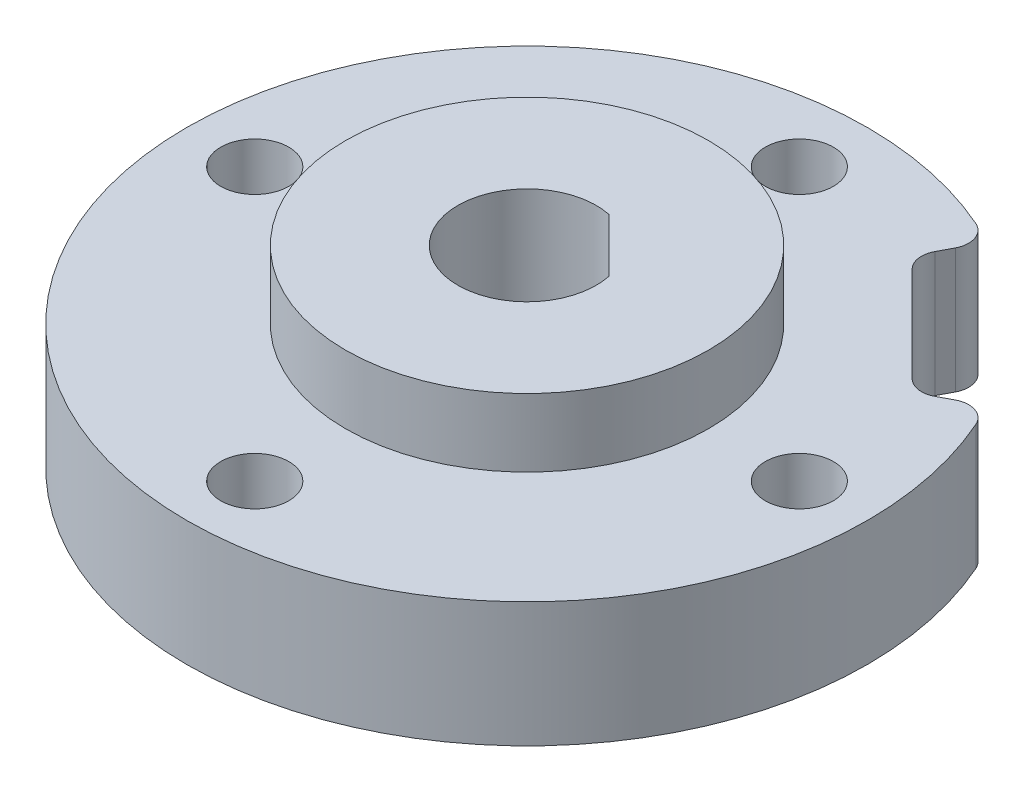
ISO-10303-21;
HEADER;
FILE_DESCRIPTION(('STEP AP214'),'2;1');
FILE_NAME('part.step','',(''),(''),'','','');
FILE_SCHEMA(('AUTOMOTIVE_DESIGN { 1 0 10303 214 1 1 1 1 }'));
ENDSEC;
DATA;
#1=APPLICATION_CONTEXT('core data for automotive mechanical design processes');
#2=APPLICATION_PROTOCOL_DEFINITION('international standard','automotive_design',2000,#1);
#3=PRODUCT_CONTEXT('',#1,'mechanical');
#4=PRODUCT('Part','Part','',(#3));
#5=PRODUCT_RELATED_PRODUCT_CATEGORY('part','',(#4));
#6=PRODUCT_DEFINITION_FORMATION('','',#4);
#7=PRODUCT_DEFINITION_CONTEXT('part definition',#1,'design');
#8=PRODUCT_DEFINITION('design','',#6,#7);
#9=PRODUCT_DEFINITION_SHAPE('','',#8);
#10=(LENGTH_UNIT() NAMED_UNIT(*) SI_UNIT(.MILLI.,.METRE.));
#11=(NAMED_UNIT(*) PLANE_ANGLE_UNIT() SI_UNIT($,.RADIAN.));
#12=(NAMED_UNIT(*) SI_UNIT($,.STERADIAN.) SOLID_ANGLE_UNIT());
#13=UNCERTAINTY_MEASURE_WITH_UNIT(LENGTH_MEASURE(1.E-05),#10,'distance_accuracy_value','');
#14=(GEOMETRIC_REPRESENTATION_CONTEXT(3) GLOBAL_UNCERTAINTY_ASSIGNED_CONTEXT((#13)) GLOBAL_UNIT_ASSIGNED_CONTEXT((#10,
#11,#12)) REPRESENTATION_CONTEXT('',''));
#15=CARTESIAN_POINT('',(0.,0.,0.));
#16=DIRECTION('',(0.,0.,1.));
#17=DIRECTION('',(1.,0.,0.));
#18=AXIS2_PLACEMENT_3D('',#15,#16,#17);
#19=CARTESIAN_POINT('',(0.,7.25,0.));
#20=DIRECTION('',(0.,-1.,0.));
#21=DIRECTION('',(0.,0.,-1.));
#22=AXIS2_PLACEMENT_3D('',#19,#20,#21);
#23=PLANE('',#22);
#24=CARTESIAN_POINT('',(0.,7.25,0.));
#25=DIRECTION('',(0.,-1.,0.));
#26=DIRECTION('',(0.,0.,-1.));
#27=AXIS2_PLACEMENT_3D('',#24,#25,#26);
#28=CIRCLE('',#27,8.);
#29=CARTESIAN_POINT('',(0.,7.25,-8.));
#30=VERTEX_POINT('',#29);
#31=EDGE_CURVE('E251',#30,#30,#28,.T.);
#32=ORIENTED_EDGE('',*,*,#31,.F.);
#33=EDGE_LOOP('',(#32));
#34=FACE_BOUND('',#33,.T.);
#35=CARTESIAN_POINT('',(0.,7.25,0.));
#36=DIRECTION('',(0.,-1.,0.));
#37=DIRECTION('',(0.,0.,-1.));
#38=AXIS2_PLACEMENT_3D('',#35,#36,#37);
#39=CIRCLE('',#38,3.05);
#40=CARTESIAN_POINT('',(0.619906335405777,7.25,-2.98633824864562));
#41=VERTEX_POINT('',#40);
#42=CARTESIAN_POINT('',(2.98633824864562,7.25,-0.619906335405768));
#43=VERTEX_POINT('',#42);
#44=EDGE_CURVE('E139',#41,#43,#39,.F.);
#45=ORIENTED_EDGE('',*,*,#44,.F.);
#46=DIRECTION('',(-0.707106781186546,0.,-0.707106781186549));
#47=VECTOR('',#46,1.);
#48=CARTESIAN_POINT('',(1.8031222920257,7.25,-1.80312229202569));
#49=LINE('',#48,#47);
#50=EDGE_CURVE('E141',#43,#41,#49,.T.);
#51=ORIENTED_EDGE('',*,*,#50,.F.);
#52=EDGE_LOOP('',(#45,#51));
#53=FACE_BOUND('',#52,.T.);
#54=ADVANCED_FACE('F46',(#34,#53),#23,.F.);
#55=CARTESIAN_POINT('',(0.,-4.25,0.));
#56=DIRECTION('',(0.,-1.,0.));
#57=DIRECTION('',(0.,0.,-1.));
#58=AXIS2_PLACEMENT_3D('',#55,#56,#57);
#59=PLANE('',#58);
#60=CARTESIAN_POINT('',(0.,-4.25,0.));
#61=DIRECTION('',(0.,-1.,0.));
#62=DIRECTION('',(0.,0.,-1.));
#63=AXIS2_PLACEMENT_3D('',#60,#61,#62);
#64=CIRCLE('',#63,8.);
#65=CARTESIAN_POINT('',(0.,-4.25,-8.));
#66=VERTEX_POINT('',#65);
#67=EDGE_CURVE('E248',#66,#66,#64,.T.);
#68=ORIENTED_EDGE('',*,*,#67,.T.);
#69=EDGE_LOOP('',(#68));
#70=FACE_BOUND('',#69,.T.);
#71=DIRECTION('',(-0.707106781186546,0.,-0.707106781186549));
#72=VECTOR('',#71,1.);
#73=CARTESIAN_POINT('',(1.8031222920257,-4.25,-1.80312229202569));
#74=LINE('',#73,#72);
#75=CARTESIAN_POINT('',(2.98633824864562,-4.25,-0.619906335405768));
#76=VERTEX_POINT('',#75);
#77=CARTESIAN_POINT('',(0.619906335405777,-4.25,-2.98633824864562));
#78=VERTEX_POINT('',#77);
#79=EDGE_CURVE('E123',#76,#78,#74,.T.);
#80=ORIENTED_EDGE('',*,*,#79,.T.);
#81=CARTESIAN_POINT('',(0.,-4.25,0.));
#82=DIRECTION('',(0.,-1.,0.));
#83=DIRECTION('',(0.,0.,-1.));
#84=AXIS2_PLACEMENT_3D('',#81,#82,#83);
#85=CIRCLE('',#84,3.05);
#86=EDGE_CURVE('E133',#78,#76,#85,.F.);
#87=ORIENTED_EDGE('',*,*,#86,.T.);
#88=EDGE_LOOP('',(#80,#87));
#89=FACE_BOUND('',#88,.T.);
#90=ADVANCED_FACE('F143',(#70,#89),#59,.T.);
#91=CARTESIAN_POINT('',(0.,7.25,0.));
#92=DIRECTION('',(0.,-1.,0.));
#93=DIRECTION('',(0.,0.,-1.));
#94=AXIS2_PLACEMENT_3D('',#91,#92,#93);
#95=CYLINDRICAL_SURFACE('',#94,8.);
#96=CARTESIAN_POINT('',(0.,4.25,0.));
#97=DIRECTION('',(0.,1.,0.));
#98=DIRECTION('',(0.,0.,1.));
#99=AXIS2_PLACEMENT_3D('',#96,#97,#98);
#100=CIRCLE('',#99,8.);
#101=CARTESIAN_POINT('',(0.,4.25,-8.));
#102=VERTEX_POINT('',#101);
#103=EDGE_CURVE('E134',#102,#102,#100,.F.);
#104=CARTESIAN_POINT('',(0.,4.25,-8.));
#105=CARTESIAN_POINT('',(0.,4.28125,-8.));
#106=CARTESIAN_POINT('',(0.,4.3125,-8.));
#107=CARTESIAN_POINT('',(0.,4.375,-8.));
#108=CARTESIAN_POINT('',(0.,4.40625,-8.));
#109=CARTESIAN_POINT('',(0.,4.46875,-8.));
#110=CARTESIAN_POINT('',(0.,4.5,-8.));
#111=CARTESIAN_POINT('',(0.,4.5625,-8.));
#112=CARTESIAN_POINT('',(0.,4.59375,-8.));
#113=CARTESIAN_POINT('',(0.,4.65625,-8.));
#114=CARTESIAN_POINT('',(0.,4.6875,-8.));
#115=CARTESIAN_POINT('',(0.,4.75,-8.));
#116=CARTESIAN_POINT('',(0.,4.78125,-8.));
#117=CARTESIAN_POINT('',(0.,4.84375,-8.));
#118=CARTESIAN_POINT('',(0.,4.875,-8.));
#119=CARTESIAN_POINT('',(0.,4.9375,-8.));
#120=CARTESIAN_POINT('',(0.,4.96875,-8.));
#121=CARTESIAN_POINT('',(0.,5.03125,-8.));
#122=CARTESIAN_POINT('',(0.,5.0625,-8.));
#123=CARTESIAN_POINT('',(0.,5.125,-8.));
#124=CARTESIAN_POINT('',(0.,5.15625,-8.));
#125=CARTESIAN_POINT('',(0.,5.21875,-8.));
#126=CARTESIAN_POINT('',(0.,5.25,-8.));
#127=CARTESIAN_POINT('',(0.,5.3125,-8.));
#128=CARTESIAN_POINT('',(0.,5.34375,-8.));
#129=CARTESIAN_POINT('',(0.,5.40625,-8.));
#130=CARTESIAN_POINT('',(0.,5.4375,-8.));
#131=CARTESIAN_POINT('',(0.,5.5,-8.));
#132=CARTESIAN_POINT('',(0.,5.53125,-8.));
#133=CARTESIAN_POINT('',(0.,5.59375,-8.));
#134=CARTESIAN_POINT('',(0.,5.625,-8.));
#135=CARTESIAN_POINT('',(0.,5.6875,-8.));
#136=CARTESIAN_POINT('',(0.,5.71875,-8.));
#137=CARTESIAN_POINT('',(0.,5.78125,-8.));
#138=CARTESIAN_POINT('',(0.,5.8125,-8.));
#139=CARTESIAN_POINT('',(0.,5.875,-8.));
#140=CARTESIAN_POINT('',(0.,5.90625,-8.));
#141=CARTESIAN_POINT('',(0.,5.96875,-8.));
#142=CARTESIAN_POINT('',(0.,6.,-8.));
#143=CARTESIAN_POINT('',(0.,6.0625,-8.));
#144=CARTESIAN_POINT('',(0.,6.09375,-8.));
#145=CARTESIAN_POINT('',(0.,6.15625,-8.));
#146=CARTESIAN_POINT('',(0.,6.1875,-8.));
#147=CARTESIAN_POINT('',(0.,6.25,-8.));
#148=CARTESIAN_POINT('',(0.,6.28125,-8.));
#149=CARTESIAN_POINT('',(0.,6.34375,-8.));
#150=CARTESIAN_POINT('',(0.,6.375,-8.));
#151=CARTESIAN_POINT('',(0.,6.4375,-8.));
#152=CARTESIAN_POINT('',(0.,6.46875,-8.));
#153=CARTESIAN_POINT('',(0.,6.53125,-8.));
#154=CARTESIAN_POINT('',(0.,6.5625,-8.));
#155=CARTESIAN_POINT('',(0.,6.625,-8.));
#156=CARTESIAN_POINT('',(0.,6.65625,-8.));
#157=CARTESIAN_POINT('',(0.,6.71875,-8.));
#158=CARTESIAN_POINT('',(0.,6.75,-8.));
#159=CARTESIAN_POINT('',(0.,6.8125,-8.));
#160=CARTESIAN_POINT('',(0.,6.84375,-8.));
#161=CARTESIAN_POINT('',(0.,6.90625,-8.));
#162=CARTESIAN_POINT('',(0.,6.9375,-8.));
#163=CARTESIAN_POINT('',(0.,7.,-8.));
#164=CARTESIAN_POINT('',(0.,7.03125,-8.));
#165=CARTESIAN_POINT('',(0.,7.09375,-8.));
#166=CARTESIAN_POINT('',(0.,7.125,-8.));
#167=CARTESIAN_POINT('',(0.,7.1875,-8.));
#168=CARTESIAN_POINT('',(0.,7.21875,-8.));
#169=CARTESIAN_POINT('',(0.,7.25,-8.));
#170=B_SPLINE_CURVE_WITH_KNOTS('',3,(#104,#105,#106,#107,#108,#109,#110,#111,#112,#113,#114,
#115,#116,#117,#118,#119,#120,#121,#122,#123,#124,#125,#126,#127,#128,#129,#130,#131,#132,#133,
#134,#135,#136,#137,#138,#139,#140,#141,#142,#143,#144,#145,#146,#147,#148,#149,#150,#151,#152,
#153,#154,#155,#156,#157,#158,#159,#160,#161,#162,#163,#164,#165,#166,#167,#168,#169),
.UNSPECIFIED.,.F.,.F.,(4,2,2,2,2,2,2,2,2,2,2,2,2,2,2,2,2,2,2,2,2,2,2,2,2,2,2,2,2,2,2,2,4),(0.,
0.0937500000000001,0.1875,0.28125,0.375,0.46875,0.5625,0.65625,0.75,0.84375,0.9375,1.03125,
1.125,1.21875,1.3125,1.40625,1.5,1.59375,1.6875,1.78125,1.875,1.96875,2.0625,2.15625,2.25,
2.34375,2.4375,2.53125,2.625,2.71875,2.8125,2.90625,3.),.UNSPECIFIED.);
#171=EDGE_CURVE('BSEAM259',#102,#30,#170,.T.);
#172=ORIENTED_EDGE('',*,*,#103,.F.);
#173=ORIENTED_EDGE('',*,*,#31,.T.);
#174=ORIENTED_EDGE('',*,*,#171,.T.);
#175=ORIENTED_EDGE('',*,*,#171,.F.);
#176=EDGE_LOOP('',(#172,#174,#173,#175));
#177=FACE_BOUND('',#176,.T.);
#178=ADVANCED_FACE('F259',(#177),#95,.T.);
#179=CARTESIAN_POINT('',(0.,4.25,0.));
#180=DIRECTION('',(0.,1.,0.));
#181=DIRECTION('',(0.,0.,1.));
#182=AXIS2_PLACEMENT_3D('',#179,#180,#181);
#183=PLANE('',#182);
#184=CARTESIAN_POINT('',(0.,4.25,0.));
#185=DIRECTION('',(0.,1.,0.));
#186=DIRECTION('',(0.,0.,1.));
#187=AXIS2_PLACEMENT_3D('',#184,#185,#186);
#188=CIRCLE('',#187,15.);
#189=CARTESIAN_POINT('',(6.05544017291545,4.25,-13.7233976956234));
#190=VERTEX_POINT('',#189);
#191=CARTESIAN_POINT('',(13.7233976956234,4.25,-6.05544017291546));
#192=VERTEX_POINT('',#191);
#193=EDGE_CURVE('E242',#190,#192,#188,.T.);
#194=ORIENTED_EDGE('',*,*,#193,.T.);
#195=CARTESIAN_POINT('',(12.8085045159152,4.25,-5.65174416138776));
#196=DIRECTION('',(0.,1.,0.));
#197=DIRECTION('',(0.,0.,1.));
#198=AXIS2_PLACEMENT_3D('',#195,#196,#197);
#199=CIRCLE('',#198,1.);
#200=CARTESIAN_POINT('',(12.3404901452442,4.25,-6.53546501598241));
#201=VERTEX_POINT('',#200);
#202=EDGE_CURVE('E180',#192,#201,#199,.T.);
#203=ORIENTED_EDGE('',*,*,#202,.T.);
#204=DIRECTION('',(0.883720854594644,0.,-0.468014370670935));
#205=VECTOR('',#204,1.);
#206=CARTESIAN_POINT('',(11.094806094211,4.25,-5.87575665426613));
#207=LINE('',#206,#205);
#208=CARTESIAN_POINT('',(11.7475977890584,4.25,-6.22147203786809));
#209=VERTEX_POINT('',#208);
#210=EDGE_CURVE('E169',#209,#201,#207,.T.);
#211=ORIENTED_EDGE('',*,*,#210,.F.);
#212=CARTESIAN_POINT('',(11.2795834183875,4.25,-7.10519289246273));
#213=DIRECTION('',(0.,1.,0.));
#214=DIRECTION('',(0.,0.,1.));
#215=AXIS2_PLACEMENT_3D('',#212,#213,#214);
#216=CIRCLE('',#215,1.);
#217=CARTESIAN_POINT('',(10.572476637201,4.25,-6.39808611127618));
#218=VERTEX_POINT('',#217);
#219=EDGE_CURVE('E199',#209,#218,#216,.F.);
#220=ORIENTED_EDGE('',*,*,#219,.T.);
#221=DIRECTION('',(0.707106781186548,0.,0.707106781186547));
#222=VECTOR('',#221,1.);
#223=CARTESIAN_POINT('',(5.87575665426613,4.25,-11.094806094211));
#224=LINE('',#223,#222);
#225=CARTESIAN_POINT('',(6.39808611127618,4.25,-10.572476637201));
#226=VERTEX_POINT('',#225);
#227=EDGE_CURVE('E210',#226,#218,#224,.T.);
#228=ORIENTED_EDGE('',*,*,#227,.F.);
#229=CARTESIAN_POINT('',(7.10519289246273,4.25,-11.2795834183875));
#230=DIRECTION('',(0.,1.,0.));
#231=DIRECTION('',(0.,0.,1.));
#232=AXIS2_PLACEMENT_3D('',#229,#230,#231);
#233=CIRCLE('',#232,1.);
#234=CARTESIAN_POINT('',(6.22147203786808,4.25,-11.7475977890584));
#235=VERTEX_POINT('',#234);
#236=EDGE_CURVE('E54',#226,#235,#233,.F.);
#237=ORIENTED_EDGE('',*,*,#236,.T.);
#238=DIRECTION('',(-0.468014370670935,0.,0.883720854594644));
#239=VECTOR('',#238,1.);
#240=CARTESIAN_POINT('',(7.02021556006404,4.25,-13.2558128189197));
#241=LINE('',#240,#239);
#242=CARTESIAN_POINT('',(6.5354650159824,4.25,-12.3404901452442));
#243=VERTEX_POINT('',#242);
#244=EDGE_CURVE('E208',#243,#235,#241,.T.);
#245=ORIENTED_EDGE('',*,*,#244,.F.);
#246=CARTESIAN_POINT('',(5.65174416138776,4.25,-12.8085045159152));
#247=DIRECTION('',(0.,1.,0.));
#248=DIRECTION('',(0.,0.,1.));
#249=AXIS2_PLACEMENT_3D('',#246,#247,#248);
#250=CIRCLE('',#249,1.);
#251=EDGE_CURVE('E178',#243,#190,#250,.T.);
#252=ORIENTED_EDGE('',*,*,#251,.T.);
#253=EDGE_LOOP('',(#194,#203,#211,#220,#228,#237,#245,#252));
#254=FACE_BOUND('',#253,.T.);
#255=CARTESIAN_POINT('',(0.,4.25,-12.));
#256=DIRECTION('',(0.,1.,0.));
#257=DIRECTION('',(0.,0.,1.));
#258=AXIS2_PLACEMENT_3D('',#255,#256,#257);
#259=CIRCLE('',#258,1.5);
#260=CARTESIAN_POINT('',(0.,4.25,-10.5));
#261=VERTEX_POINT('',#260);
#262=EDGE_CURVE('E166',#261,#261,#259,.T.);
#263=ORIENTED_EDGE('',*,*,#262,.F.);
#264=EDGE_LOOP('',(#263));
#265=FACE_BOUND('',#264,.T.);
#266=CARTESIAN_POINT('',(-12.,4.25,5.16947595841089E-13));
#267=DIRECTION('',(0.,1.,0.));
#268=DIRECTION('',(0.,0.,1.));
#269=AXIS2_PLACEMENT_3D('',#266,#267,#268);
#270=CIRCLE('',#269,1.5);
#271=CARTESIAN_POINT('',(-12.,4.25,1.50000000000052));
#272=VERTEX_POINT('',#271);
#273=EDGE_CURVE('E162',#272,#272,#270,.T.);
#274=ORIENTED_EDGE('',*,*,#273,.F.);
#275=EDGE_LOOP('',(#274));
#276=FACE_BOUND('',#275,.T.);
#277=CARTESIAN_POINT('',(12.0000000000005,4.25,5.09599715046204E-13));
#278=DIRECTION('',(0.,1.,0.));
#279=DIRECTION('',(0.,0.,1.));
#280=AXIS2_PLACEMENT_3D('',#277,#278,#279);
#281=CIRCLE('',#280,1.50000000000016);
#282=CARTESIAN_POINT('',(12.0000000000005,4.25,1.50000000000067));
#283=VERTEX_POINT('',#282);
#284=EDGE_CURVE('E158',#283,#283,#281,.T.);
#285=ORIENTED_EDGE('',*,*,#284,.F.);
#286=EDGE_LOOP('',(#285));
#287=FACE_BOUND('',#286,.T.);
#288=CARTESIAN_POINT('',(0.,4.25,12.));
#289=DIRECTION('',(0.,1.,0.));
#290=DIRECTION('',(0.,0.,1.));
#291=AXIS2_PLACEMENT_3D('',#288,#289,#290);
#292=CIRCLE('',#291,1.5);
#293=CARTESIAN_POINT('',(0.,4.25,13.5));
#294=VERTEX_POINT('',#293);
#295=EDGE_CURVE('E153',#294,#294,#292,.T.);
#296=ORIENTED_EDGE('',*,*,#295,.F.);
#297=EDGE_LOOP('',(#296));
#298=FACE_BOUND('',#297,.T.);
#299=ORIENTED_EDGE('',*,*,#103,.T.);
#300=EDGE_LOOP('',(#299));
#301=FACE_BOUND('',#300,.T.);
#302=ADVANCED_FACE('F206',(#254,#265,#276,#287,#298,#301),#183,.T.);
#303=CARTESIAN_POINT('',(0.,3.,0.));
#304=DIRECTION('',(0.,-1.,0.));
#305=DIRECTION('',(0.,0.,-1.));
#306=AXIS2_PLACEMENT_3D('',#303,#304,#305);
#307=CYLINDRICAL_SURFACE('',#306,15.);
#308=CARTESIAN_POINT('',(0.,-1.25,0.));
#309=DIRECTION('',(0.,1.,0.));
#310=DIRECTION('',(0.,0.,1.));
#311=AXIS2_PLACEMENT_3D('',#308,#309,#310);
#312=CIRCLE('',#311,15.);
#313=CARTESIAN_POINT('',(6.05544017291545,-1.25,-13.7233976956234));
#314=VERTEX_POINT('',#313);
#315=CARTESIAN_POINT('',(13.7233976956234,-1.25,-6.05544017291546));
#316=VERTEX_POINT('',#315);
#317=EDGE_CURVE('E244',#314,#316,#312,.T.);
#318=ORIENTED_EDGE('',*,*,#317,.T.);
#319=DIRECTION('',(0.,-1.,0.));
#320=VECTOR('',#319,1.);
#321=CARTESIAN_POINT('',(13.7233976956234,3.,-6.05544017291546));
#322=LINE('',#321,#320);
#323=EDGE_CURVE('E175',#316,#192,#322,.F.);
#324=ORIENTED_EDGE('',*,*,#323,.T.);
#325=ORIENTED_EDGE('',*,*,#193,.F.);
#326=DIRECTION('',(0.,-1.,0.));
#327=VECTOR('',#326,1.);
#328=CARTESIAN_POINT('',(6.05544017291546,3.,-13.7233976956234));
#329=LINE('',#328,#327);
#330=EDGE_CURVE('E173',#190,#314,#329,.T.);
#331=ORIENTED_EDGE('',*,*,#330,.T.);
#332=EDGE_LOOP('',(#318,#324,#325,#331));
#333=FACE_BOUND('',#332,.T.);
#334=ADVANCED_FACE('F276',(#333),#307,.T.);
#335=CARTESIAN_POINT('',(0.,-1.25,0.));
#336=DIRECTION('',(0.,1.,0.));
#337=DIRECTION('',(0.,0.,1.));
#338=AXIS2_PLACEMENT_3D('',#335,#336,#337);
#339=PLANE('',#338);
#340=CARTESIAN_POINT('',(0.,-1.25,-12.));
#341=DIRECTION('',(0.,1.,0.));
#342=DIRECTION('',(0.,0.,1.));
#343=AXIS2_PLACEMENT_3D('',#340,#341,#342);
#344=CIRCLE('',#343,1.5);
#345=CARTESIAN_POINT('',(0.,-1.25,-10.5));
#346=VERTEX_POINT('',#345);
#347=EDGE_CURVE('E163',#346,#346,#344,.T.);
#348=ORIENTED_EDGE('',*,*,#347,.T.);
#349=EDGE_LOOP('',(#348));
#350=FACE_BOUND('',#349,.T.);
#351=CARTESIAN_POINT('',(-12.,-1.25,5.16947595841089E-13));
#352=DIRECTION('',(0.,1.,0.));
#353=DIRECTION('',(0.,0.,1.));
#354=AXIS2_PLACEMENT_3D('',#351,#352,#353);
#355=CIRCLE('',#354,1.5);
#356=CARTESIAN_POINT('',(-12.,-1.25,1.50000000000052));
#357=VERTEX_POINT('',#356);
#358=EDGE_CURVE('E159',#357,#357,#355,.T.);
#359=ORIENTED_EDGE('',*,*,#358,.T.);
#360=EDGE_LOOP('',(#359));
#361=FACE_BOUND('',#360,.T.);
#362=CARTESIAN_POINT('',(12.0000000000005,-1.25,5.09599715046204E-13));
#363=DIRECTION('',(0.,1.,0.));
#364=DIRECTION('',(0.,0.,1.));
#365=AXIS2_PLACEMENT_3D('',#362,#363,#364);
#366=CIRCLE('',#365,1.50000000000016);
#367=CARTESIAN_POINT('',(12.0000000000005,-1.25,1.50000000000067));
#368=VERTEX_POINT('',#367);
#369=EDGE_CURVE('E155',#368,#368,#366,.T.);
#370=ORIENTED_EDGE('',*,*,#369,.T.);
#371=EDGE_LOOP('',(#370));
#372=FACE_BOUND('',#371,.T.);
#373=CARTESIAN_POINT('',(0.,-1.25,12.));
#374=DIRECTION('',(0.,1.,0.));
#375=DIRECTION('',(0.,0.,1.));
#376=AXIS2_PLACEMENT_3D('',#373,#374,#375);
#377=CIRCLE('',#376,1.5);
#378=CARTESIAN_POINT('',(0.,-1.25,13.5));
#379=VERTEX_POINT('',#378);
#380=EDGE_CURVE('E150',#379,#379,#377,.T.);
#381=ORIENTED_EDGE('',*,*,#380,.T.);
#382=EDGE_LOOP('',(#381));
#383=FACE_BOUND('',#382,.T.);
#384=CARTESIAN_POINT('',(0.,-1.25,0.));
#385=DIRECTION('',(0.,1.,0.));
#386=DIRECTION('',(0.,0.,1.));
#387=AXIS2_PLACEMENT_3D('',#384,#385,#386);
#388=CIRCLE('',#387,8.);
#389=CARTESIAN_POINT('',(0.,-1.25,-8.));
#390=VERTEX_POINT('',#389);
#391=EDGE_CURVE('E247',#390,#390,#388,.F.);
#392=ORIENTED_EDGE('',*,*,#391,.F.);
#393=EDGE_LOOP('',(#392));
#394=FACE_BOUND('',#393,.T.);
#395=DIRECTION('',(0.883720854594644,0.,-0.468014370670935));
#396=VECTOR('',#395,1.);
#397=CARTESIAN_POINT('',(0.,-1.25,0.));
#398=LINE('',#397,#396);
#399=CARTESIAN_POINT('',(11.7475977890584,-1.25,-6.22147203786809));
#400=VERTEX_POINT('',#399);
#401=CARTESIAN_POINT('',(12.3404901452442,-1.25,-6.53546501598241));
#402=VERTEX_POINT('',#401);
#403=EDGE_CURVE('E146',#400,#402,#398,.T.);
#404=ORIENTED_EDGE('',*,*,#403,.T.);
#405=CARTESIAN_POINT('',(12.8085045159152,-1.25,-5.65174416138776));
#406=DIRECTION('',(0.,1.,0.));
#407=DIRECTION('',(0.,0.,1.));
#408=AXIS2_PLACEMENT_3D('',#405,#406,#407);
#409=CIRCLE('',#408,1.);
#410=EDGE_CURVE('E188',#402,#316,#409,.F.);
#411=ORIENTED_EDGE('',*,*,#410,.T.);
#412=ORIENTED_EDGE('',*,*,#317,.F.);
#413=CARTESIAN_POINT('',(5.65174416138776,-1.25,-12.8085045159152));
#414=DIRECTION('',(0.,1.,0.));
#415=DIRECTION('',(0.,0.,1.));
#416=AXIS2_PLACEMENT_3D('',#413,#414,#415);
#417=CIRCLE('',#416,1.);
#418=CARTESIAN_POINT('',(6.5354650159824,-1.25,-12.3404901452442));
#419=VERTEX_POINT('',#418);
#420=EDGE_CURVE('E68',#314,#419,#417,.F.);
#421=ORIENTED_EDGE('',*,*,#420,.T.);
#422=DIRECTION('',(-0.468014370670935,0.,0.883720854594644));
#423=VECTOR('',#422,1.);
#424=CARTESIAN_POINT('',(0.,-1.25,0.));
#425=LINE('',#424,#423);
#426=CARTESIAN_POINT('',(6.22147203786809,-1.25,-11.7475977890584));
#427=VERTEX_POINT('',#426);
#428=EDGE_CURVE('E144',#419,#427,#425,.T.);
#429=ORIENTED_EDGE('',*,*,#428,.T.);
#430=CARTESIAN_POINT('',(7.10519289246273,-1.25,-11.2795834183875));
#431=DIRECTION('',(0.,1.,0.));
#432=DIRECTION('',(0.,0.,1.));
#433=AXIS2_PLACEMENT_3D('',#430,#431,#432);
#434=CIRCLE('',#433,1.);
#435=CARTESIAN_POINT('',(6.39808611127618,-1.25,-10.572476637201));
#436=VERTEX_POINT('',#435);
#437=EDGE_CURVE('E13',#427,#436,#434,.T.);
#438=ORIENTED_EDGE('',*,*,#437,.T.);
#439=DIRECTION('',(0.707106781186548,0.,0.707106781186547));
#440=VECTOR('',#439,1.);
#441=CARTESIAN_POINT('',(8.48528137423857,-1.25,-8.48528137423857));
#442=LINE('',#441,#440);
#443=CARTESIAN_POINT('',(10.572476637201,-1.25,-6.39808611127619));
#444=VERTEX_POINT('',#443);
#445=EDGE_CURVE('E154',#436,#444,#442,.T.);
#446=ORIENTED_EDGE('',*,*,#445,.T.);
#447=CARTESIAN_POINT('',(11.2795834183875,-1.25,-7.10519289246273));
#448=DIRECTION('',(0.,1.,0.));
#449=DIRECTION('',(0.,0.,1.));
#450=AXIS2_PLACEMENT_3D('',#447,#448,#449);
#451=CIRCLE('',#450,1.);
#452=EDGE_CURVE('E201',#444,#400,#451,.T.);
#453=ORIENTED_EDGE('',*,*,#452,.T.);
#454=EDGE_LOOP('',(#404,#411,#412,#421,#429,#438,#446,#453));
#455=FACE_BOUND('',#454,.T.);
#456=ADVANCED_FACE('F219',(#350,#361,#372,#383,#394,#455),#339,.F.);
#457=CARTESIAN_POINT('',(0.,-4.25,-8.));
#458=CARTESIAN_POINT('',(0.,-4.21875,-8.));
#459=CARTESIAN_POINT('',(0.,-4.1875,-8.));
#460=CARTESIAN_POINT('',(0.,-4.125,-8.));
#461=CARTESIAN_POINT('',(0.,-4.09375,-8.));
#462=CARTESIAN_POINT('',(0.,-4.03125,-8.));
#463=CARTESIAN_POINT('',(0.,-4.,-8.));
#464=CARTESIAN_POINT('',(0.,-3.9375,-8.));
#465=CARTESIAN_POINT('',(0.,-3.90625,-8.));
#466=CARTESIAN_POINT('',(0.,-3.84375,-8.));
#467=CARTESIAN_POINT('',(0.,-3.8125,-8.));
#468=CARTESIAN_POINT('',(0.,-3.75,-8.));
#469=CARTESIAN_POINT('',(0.,-3.71875,-8.));
#470=CARTESIAN_POINT('',(0.,-3.65625,-8.));
#471=CARTESIAN_POINT('',(0.,-3.625,-8.));
#472=CARTESIAN_POINT('',(0.,-3.5625,-8.));
#473=CARTESIAN_POINT('',(0.,-3.53125,-8.));
#474=CARTESIAN_POINT('',(0.,-3.46875,-8.));
#475=CARTESIAN_POINT('',(0.,-3.4375,-8.));
#476=CARTESIAN_POINT('',(0.,-3.375,-8.));
#477=CARTESIAN_POINT('',(0.,-3.34375,-8.));
#478=CARTESIAN_POINT('',(0.,-3.28125,-8.));
#479=CARTESIAN_POINT('',(0.,-3.25,-8.));
#480=CARTESIAN_POINT('',(0.,-3.1875,-8.));
#481=CARTESIAN_POINT('',(0.,-3.15625,-8.));
#482=CARTESIAN_POINT('',(0.,-3.09375,-8.));
#483=CARTESIAN_POINT('',(0.,-3.0625,-8.));
#484=CARTESIAN_POINT('',(0.,-3.,-8.));
#485=CARTESIAN_POINT('',(0.,-2.96875,-8.));
#486=CARTESIAN_POINT('',(0.,-2.90625,-8.));
#487=CARTESIAN_POINT('',(0.,-2.875,-8.));
#488=CARTESIAN_POINT('',(0.,-2.8125,-8.));
#489=CARTESIAN_POINT('',(0.,-2.78125,-8.));
#490=CARTESIAN_POINT('',(0.,-2.71875,-8.));
#491=CARTESIAN_POINT('',(0.,-2.6875,-8.));
#492=CARTESIAN_POINT('',(0.,-2.625,-8.));
#493=CARTESIAN_POINT('',(0.,-2.59375,-8.));
#494=CARTESIAN_POINT('',(0.,-2.53125,-8.));
#495=CARTESIAN_POINT('',(0.,-2.5,-8.));
#496=CARTESIAN_POINT('',(0.,-2.4375,-8.));
#497=CARTESIAN_POINT('',(0.,-2.40625,-8.));
#498=CARTESIAN_POINT('',(0.,-2.34375,-8.));
#499=CARTESIAN_POINT('',(0.,-2.3125,-8.));
#500=CARTESIAN_POINT('',(0.,-2.25,-8.));
#501=CARTESIAN_POINT('',(0.,-2.21875,-8.));
#502=CARTESIAN_POINT('',(0.,-2.15625,-8.));
#503=CARTESIAN_POINT('',(0.,-2.125,-8.));
#504=CARTESIAN_POINT('',(0.,-2.0625,-8.));
#505=CARTESIAN_POINT('',(0.,-2.03125,-8.));
#506=CARTESIAN_POINT('',(0.,-1.96875,-8.));
#507=CARTESIAN_POINT('',(0.,-1.9375,-8.));
#508=CARTESIAN_POINT('',(0.,-1.875,-8.));
#509=CARTESIAN_POINT('',(0.,-1.84375,-8.));
#510=CARTESIAN_POINT('',(0.,-1.78125,-8.));
#511=CARTESIAN_POINT('',(0.,-1.75,-8.));
#512=CARTESIAN_POINT('',(0.,-1.6875,-8.));
#513=CARTESIAN_POINT('',(0.,-1.65625,-8.));
#514=CARTESIAN_POINT('',(0.,-1.59375,-8.));
#515=CARTESIAN_POINT('',(0.,-1.5625,-8.));
#516=CARTESIAN_POINT('',(0.,-1.5,-8.));
#517=CARTESIAN_POINT('',(0.,-1.46875,-8.));
#518=CARTESIAN_POINT('',(0.,-1.40625,-8.));
#519=CARTESIAN_POINT('',(0.,-1.375,-8.));
#520=CARTESIAN_POINT('',(0.,-1.3125,-8.));
#521=CARTESIAN_POINT('',(0.,-1.28125,-8.));
#522=CARTESIAN_POINT('',(0.,-1.25,-8.));
#523=B_SPLINE_CURVE_WITH_KNOTS('',3,(#457,#458,#459,#460,#461,#462,#463,#464,#465,#466,#467,
#468,#469,#470,#471,#472,#473,#474,#475,#476,#477,#478,#479,#480,#481,#482,#483,#484,#485,#486,
#487,#488,#489,#490,#491,#492,#493,#494,#495,#496,#497,#498,#499,#500,#501,#502,#503,#504,#505,
#506,#507,#508,#509,#510,#511,#512,#513,#514,#515,#516,#517,#518,#519,#520,#521,#522),
.UNSPECIFIED.,.F.,.F.,(4,2,2,2,2,2,2,2,2,2,2,2,2,2,2,2,2,2,2,2,2,2,2,2,2,2,2,2,2,2,2,2,4),(0.,
0.0937500000000001,0.1875,0.28125,0.375,0.46875,0.5625,0.656250000000001,0.750000000000001,
0.843749999999999,0.937499999999999,1.03125,1.125,1.21875,1.3125,1.40625,1.5,1.59375,1.6875,
1.78125,1.875,1.96875,2.0625,2.15625,2.25,2.34375,2.4375,2.53125,2.625,2.71875,2.8125,2.90625,
3.),.UNSPECIFIED.);
#524=EDGE_CURVE('BSEAM263',#66,#390,#523,.T.);
#525=ORIENTED_EDGE('',*,*,#67,.F.);
#526=ORIENTED_EDGE('',*,*,#391,.T.);
#527=ORIENTED_EDGE('',*,*,#524,.T.);
#528=ORIENTED_EDGE('',*,*,#524,.F.);
#529=EDGE_LOOP('',(#525,#527,#526,#528));
#530=FACE_BOUND('',#529,.T.);
#531=ADVANCED_FACE('F263',(#530),#95,.T.);
#532=CARTESIAN_POINT('',(0.,8.,0.));
#533=DIRECTION('',(0.,-1.,0.));
#534=DIRECTION('',(0.,0.,-1.));
#535=AXIS2_PLACEMENT_3D('',#532,#533,#534);
#536=CYLINDRICAL_SURFACE('',#535,3.05);
#537=ORIENTED_EDGE('',*,*,#44,.T.);
#538=DIRECTION('',(0.,-1.,0.));
#539=VECTOR('',#538,1.);
#540=CARTESIAN_POINT('',(2.98633824864562,8.,-0.619906335405768));
#541=LINE('',#540,#539);
#542=EDGE_CURVE('E126',#43,#76,#541,.T.);
#543=ORIENTED_EDGE('',*,*,#542,.T.);
#544=ORIENTED_EDGE('',*,*,#86,.F.);
#545=DIRECTION('',(0.,-1.,0.));
#546=VECTOR('',#545,1.);
#547=CARTESIAN_POINT('',(0.619906335405777,8.,-2.98633824864562));
#548=LINE('',#547,#546);
#549=EDGE_CURVE('E129',#41,#78,#548,.T.);
#550=ORIENTED_EDGE('',*,*,#549,.F.);
#551=EDGE_LOOP('',(#537,#543,#544,#550));
#552=FACE_BOUND('',#551,.T.);
#553=ADVANCED_FACE('F137',(#552),#536,.F.);
#554=CARTESIAN_POINT('',(0.619906335405777,8.,-2.98633824864562));
#555=DIRECTION('',(-0.707106781186549,0.,0.707106781186546));
#556=DIRECTION('',(0.707106781186546,0.,0.707106781186549));
#557=AXIS2_PLACEMENT_3D('',#554,#555,#556);
#558=PLANE('',#557);
#559=CARTESIAN_POINT('',(1.8031222920257,1.5,-1.80312229202569));
#560=DIRECTION('',(-0.707106781186549,0.,0.707106781186546));
#561=DIRECTION('',(0.707106781186546,0.,0.707106781186549));
#562=AXIS2_PLACEMENT_3D('',#559,#560,#561);
#563=CIRCLE('',#562,1.3);
#564=CARTESIAN_POINT('',(2.72236110756821,1.5,-0.88388347648318));
#565=VERTEX_POINT('',#564);
#566=EDGE_CURVE('E236',#565,#565,#563,.T.);
#567=ORIENTED_EDGE('',*,*,#566,.F.);
#568=EDGE_LOOP('',(#567));
#569=FACE_BOUND('',#568,.T.);
#570=ORIENTED_EDGE('',*,*,#50,.T.);
#571=ORIENTED_EDGE('',*,*,#549,.T.);
#572=ORIENTED_EDGE('',*,*,#79,.F.);
#573=ORIENTED_EDGE('',*,*,#542,.F.);
#574=EDGE_LOOP('',(#570,#571,#572,#573));
#575=FACE_BOUND('',#574,.T.);
#576=ADVANCED_FACE('F125',(#569,#575),#558,.T.);
#577=CARTESIAN_POINT('',(11.7026172286374,1.5,-11.7026172286373));
#578=DIRECTION('',(-0.707106781186549,0.,0.707106781186547));
#579=DIRECTION('',(0.707106781186546,0.,0.707106781186549));
#580=AXIS2_PLACEMENT_3D('',#577,#578,#579);
#581=CYLINDRICAL_SURFACE('',#580,1.3);
#582=CARTESIAN_POINT('',(8.48528137423858,1.5,-8.48528137423856));
#583=DIRECTION('',(-0.707106781186547,0.,0.707106781186548));
#584=DIRECTION('',(0.707106781186548,0.,0.707106781186547));
#585=AXIS2_PLACEMENT_3D('',#582,#583,#584);
#586=CIRCLE('',#585,1.3);
#587=CARTESIAN_POINT('',(9.40452018978109,1.5,-7.56604255869605));
#588=VERTEX_POINT('',#587);
#589=EDGE_CURVE('E167',#588,#588,#586,.F.);
#590=ORIENTED_EDGE('',*,*,#589,.T.);
#591=EDGE_LOOP('',(#590));
#592=FACE_BOUND('',#591,.T.);
#593=ORIENTED_EDGE('',*,*,#566,.T.);
#594=EDGE_LOOP('',(#593));
#595=FACE_BOUND('',#594,.T.);
#596=ADVANCED_FACE('F329',(#592,#595),#581,.F.);
#597=CARTESIAN_POINT('',(0.,-6.75,12.));
#598=DIRECTION('',(0.,1.,0.));
#599=DIRECTION('',(0.,0.,1.));
#600=AXIS2_PLACEMENT_3D('',#597,#598,#599);
#601=CYLINDRICAL_SURFACE('',#600,1.5);
#602=ORIENTED_EDGE('',*,*,#295,.T.);
#603=EDGE_LOOP('',(#602));
#604=FACE_BOUND('',#603,.T.);
#605=ORIENTED_EDGE('',*,*,#380,.F.);
#606=EDGE_LOOP('',(#605));
#607=FACE_BOUND('',#606,.T.);
#608=ADVANCED_FACE('F325',(#604,#607),#601,.F.);
#609=CARTESIAN_POINT('',(12.0000000000005,-6.75,5.09599715046204E-13));
#610=DIRECTION('',(0.,1.,0.));
#611=DIRECTION('',(0.,0.,1.));
#612=AXIS2_PLACEMENT_3D('',#609,#610,#611);
#613=CYLINDRICAL_SURFACE('',#612,1.50000000000016);
#614=ORIENTED_EDGE('',*,*,#284,.T.);
#615=EDGE_LOOP('',(#614));
#616=FACE_BOUND('',#615,.T.);
#617=ORIENTED_EDGE('',*,*,#369,.F.);
#618=EDGE_LOOP('',(#617));
#619=FACE_BOUND('',#618,.T.);
#620=ADVANCED_FACE('F321',(#616,#619),#613,.F.);
#621=CARTESIAN_POINT('',(-12.,-6.75,5.16947595841089E-13));
#622=DIRECTION('',(0.,1.,0.));
#623=DIRECTION('',(0.,0.,1.));
#624=AXIS2_PLACEMENT_3D('',#621,#622,#623);
#625=CYLINDRICAL_SURFACE('',#624,1.5);
#626=ORIENTED_EDGE('',*,*,#273,.T.);
#627=EDGE_LOOP('',(#626));
#628=FACE_BOUND('',#627,.T.);
#629=ORIENTED_EDGE('',*,*,#358,.F.);
#630=EDGE_LOOP('',(#629));
#631=FACE_BOUND('',#630,.T.);
#632=ADVANCED_FACE('F312',(#628,#631),#625,.F.);
#633=CARTESIAN_POINT('',(0.,-6.75,-12.));
#634=DIRECTION('',(0.,1.,0.));
#635=DIRECTION('',(0.,0.,1.));
#636=AXIS2_PLACEMENT_3D('',#633,#634,#635);
#637=CYLINDRICAL_SURFACE('',#636,1.5);
#638=ORIENTED_EDGE('',*,*,#262,.T.);
#639=EDGE_LOOP('',(#638));
#640=FACE_BOUND('',#639,.T.);
#641=ORIENTED_EDGE('',*,*,#347,.F.);
#642=EDGE_LOOP('',(#641));
#643=FACE_BOUND('',#642,.T.);
#644=ADVANCED_FACE('F305',(#640,#643),#637,.F.);
#645=CARTESIAN_POINT('',(11.094806094211,-9.75,-5.87575665426613));
#646=DIRECTION('',(0.468014370670935,0.,0.883720854594644));
#647=DIRECTION('',(0.883720854594644,0.,-0.468014370670935));
#648=AXIS2_PLACEMENT_3D('',#645,#646,#647);
#649=PLANE('',#648);
#650=ORIENTED_EDGE('',*,*,#210,.T.);
#651=DIRECTION('',(0.,-1.,0.));
#652=VECTOR('',#651,1.);
#653=CARTESIAN_POINT('',(12.3404901452442,-9.75,-6.53546501598241));
#654=LINE('',#653,#652);
#655=EDGE_CURVE('E185',#201,#402,#654,.T.);
#656=ORIENTED_EDGE('',*,*,#655,.T.);
#657=ORIENTED_EDGE('',*,*,#403,.F.);
#658=DIRECTION('',(0.,1.,0.));
#659=VECTOR('',#658,1.);
#660=CARTESIAN_POINT('',(11.7475977890584,4.25,-6.22147203786809));
#661=LINE('',#660,#659);
#662=EDGE_CURVE('E182',#400,#209,#661,.T.);
#663=ORIENTED_EDGE('',*,*,#662,.T.);
#664=EDGE_LOOP('',(#650,#656,#657,#663));
#665=FACE_BOUND('',#664,.T.);
#666=ADVANCED_FACE('F298',(#665),#649,.F.);
#667=CARTESIAN_POINT('',(7.02021556006404,-9.75,-13.2558128189197));
#668=DIRECTION('',(-0.883720854594644,0.,-0.468014370670935));
#669=DIRECTION('',(-0.468014370670935,0.,0.883720854594644));
#670=AXIS2_PLACEMENT_3D('',#667,#668,#669);
#671=PLANE('',#670);
#672=ORIENTED_EDGE('',*,*,#428,.F.);
#673=DIRECTION('',(0.,-1.,0.));
#674=VECTOR('',#673,1.);
#675=CARTESIAN_POINT('',(6.5354650159824,-9.75,-12.3404901452442));
#676=LINE('',#675,#674);
#677=EDGE_CURVE('E191',#419,#243,#676,.F.);
#678=ORIENTED_EDGE('',*,*,#677,.T.);
#679=ORIENTED_EDGE('',*,*,#244,.T.);
#680=DIRECTION('',(0.,1.,0.));
#681=VECTOR('',#680,1.);
#682=CARTESIAN_POINT('',(6.22147203786808,-1.25,-11.7475977890584));
#683=LINE('',#682,#681);
#684=EDGE_CURVE('E61',#235,#427,#683,.F.);
#685=ORIENTED_EDGE('',*,*,#684,.T.);
#686=EDGE_LOOP('',(#672,#678,#679,#685));
#687=FACE_BOUND('',#686,.T.);
#688=ADVANCED_FACE('F213',(#687),#671,.F.);
#689=CARTESIAN_POINT('',(5.87575665426613,-9.75,-11.094806094211));
#690=DIRECTION('',(-0.707106781186547,0.,0.707106781186548));
#691=DIRECTION('',(0.707106781186548,0.,0.707106781186547));
#692=AXIS2_PLACEMENT_3D('',#689,#690,#691);
#693=PLANE('',#692);
#694=ORIENTED_EDGE('',*,*,#589,.F.);
#695=EDGE_LOOP('',(#694));
#696=FACE_BOUND('',#695,.T.);
#697=ORIENTED_EDGE('',*,*,#227,.T.);
#698=DIRECTION('',(0.,1.,0.));
#699=VECTOR('',#698,1.);
#700=CARTESIAN_POINT('',(10.572476637201,-1.25,-6.39808611127619));
#701=LINE('',#700,#699);
#702=EDGE_CURVE('E197',#218,#444,#701,.F.);
#703=ORIENTED_EDGE('',*,*,#702,.T.);
#704=ORIENTED_EDGE('',*,*,#445,.F.);
#705=DIRECTION('',(0.,1.,0.));
#706=VECTOR('',#705,1.);
#707=CARTESIAN_POINT('',(6.39808611127618,4.25,-10.572476637201));
#708=LINE('',#707,#706);
#709=EDGE_CURVE('E194',#436,#226,#708,.T.);
#710=ORIENTED_EDGE('',*,*,#709,.T.);
#711=EDGE_LOOP('',(#697,#703,#704,#710));
#712=FACE_BOUND('',#711,.T.);
#713=ADVANCED_FACE('F222',(#696,#712),#693,.F.);
#714=CARTESIAN_POINT('',(12.8085045159152,3.,-5.65174416138776));
#715=DIRECTION('',(0.,-1.,0.));
#716=DIRECTION('',(0.,0.,-1.));
#717=AXIS2_PLACEMENT_3D('',#714,#715,#716);
#718=CYLINDRICAL_SURFACE('',#717,1.);
#719=ORIENTED_EDGE('',*,*,#410,.F.);
#720=ORIENTED_EDGE('',*,*,#655,.F.);
#721=ORIENTED_EDGE('',*,*,#202,.F.);
#722=ORIENTED_EDGE('',*,*,#323,.F.);
#723=EDGE_LOOP('',(#719,#720,#721,#722));
#724=FACE_BOUND('',#723,.T.);
#725=ADVANCED_FACE('F280',(#724),#718,.T.);
#726=CARTESIAN_POINT('',(5.65174416138776,3.,-12.8085045159152));
#727=DIRECTION('',(0.,-1.,0.));
#728=DIRECTION('',(0.,0.,-1.));
#729=AXIS2_PLACEMENT_3D('',#726,#727,#728);
#730=CYLINDRICAL_SURFACE('',#729,1.);
#731=ORIENTED_EDGE('',*,*,#420,.F.);
#732=ORIENTED_EDGE('',*,*,#330,.F.);
#733=ORIENTED_EDGE('',*,*,#251,.F.);
#734=ORIENTED_EDGE('',*,*,#677,.F.);
#735=EDGE_LOOP('',(#731,#732,#733,#734));
#736=FACE_BOUND('',#735,.T.);
#737=ADVANCED_FACE('F283',(#736),#730,.T.);
#738=CARTESIAN_POINT('',(11.2795834183875,-9.75,-7.10519289246273));
#739=DIRECTION('',(0.,-1.,0.));
#740=DIRECTION('',(0.,0.,-1.));
#741=AXIS2_PLACEMENT_3D('',#738,#739,#740);
#742=CYLINDRICAL_SURFACE('',#741,1.);
#743=ORIENTED_EDGE('',*,*,#452,.F.);
#744=ORIENTED_EDGE('',*,*,#702,.F.);
#745=ORIENTED_EDGE('',*,*,#219,.F.);
#746=ORIENTED_EDGE('',*,*,#662,.F.);
#747=EDGE_LOOP('',(#743,#744,#745,#746));
#748=FACE_BOUND('',#747,.T.);
#749=ADVANCED_FACE('F286',(#748),#742,.F.);
#750=CARTESIAN_POINT('',(7.10519289246273,-9.75,-11.2795834183875));
#751=DIRECTION('',(0.,-1.,0.));
#752=DIRECTION('',(0.,0.,-1.));
#753=AXIS2_PLACEMENT_3D('',#750,#751,#752);
#754=CYLINDRICAL_SURFACE('',#753,1.);
#755=ORIENTED_EDGE('',*,*,#437,.F.);
#756=ORIENTED_EDGE('',*,*,#684,.F.);
#757=ORIENTED_EDGE('',*,*,#236,.F.);
#758=ORIENTED_EDGE('',*,*,#709,.F.);
#759=EDGE_LOOP('',(#755,#756,#757,#758));
#760=FACE_BOUND('',#759,.T.);
#761=ADVANCED_FACE('F48',(#760),#754,.F.);
#762=CLOSED_SHELL('',(#54,#90,#178,#302,#334,#456,#531,#553,#576,#596,#608,#620,#632,#644,#666,
#688,#713,#725,#737,#749,#761));
#763=MANIFOLD_SOLID_BREP('B2',#762);
#764=ADVANCED_BREP_SHAPE_REPRESENTATION('',(#18,#763),#14);
#765=SHAPE_DEFINITION_REPRESENTATION(#9,#764);
ENDSEC;
END-ISO-10303-21;
